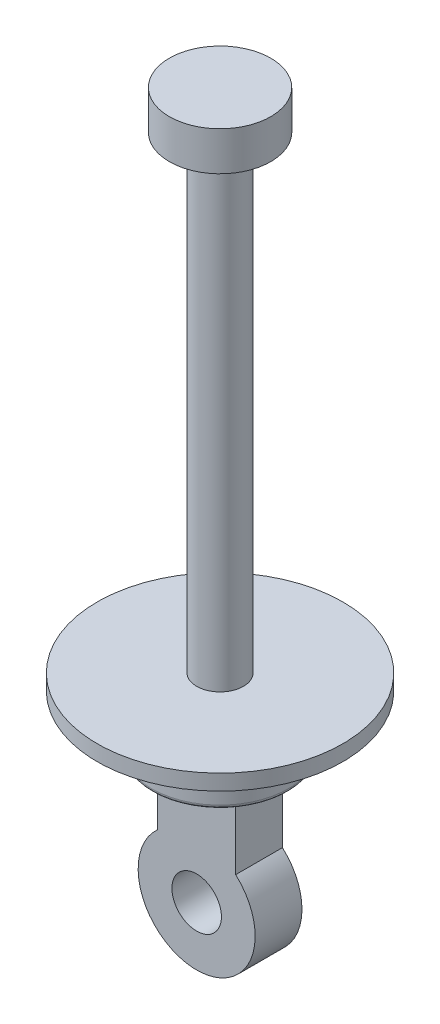
ISO-10303-21;
HEADER;
FILE_DESCRIPTION(('STEP AP214'),'2;1');
FILE_NAME('part.step','',(''),(''),'','','');
FILE_SCHEMA(('AUTOMOTIVE_DESIGN { 1 0 10303 214 1 1 1 1 }'));
ENDSEC;
DATA;
#1=APPLICATION_CONTEXT('core data for automotive mechanical design processes');
#2=APPLICATION_PROTOCOL_DEFINITION('international standard','automotive_design',2000,#1);
#3=PRODUCT_CONTEXT('',#1,'mechanical');
#4=PRODUCT('Part','Part','',(#3));
#5=PRODUCT_RELATED_PRODUCT_CATEGORY('part','',(#4));
#6=PRODUCT_DEFINITION_FORMATION('','',#4);
#7=PRODUCT_DEFINITION_CONTEXT('part definition',#1,'design');
#8=PRODUCT_DEFINITION('design','',#6,#7);
#9=PRODUCT_DEFINITION_SHAPE('','',#8);
#10=(LENGTH_UNIT() NAMED_UNIT(*) SI_UNIT(.MILLI.,.METRE.));
#11=(NAMED_UNIT(*) PLANE_ANGLE_UNIT() SI_UNIT($,.RADIAN.));
#12=(NAMED_UNIT(*) SI_UNIT($,.STERADIAN.) SOLID_ANGLE_UNIT());
#13=UNCERTAINTY_MEASURE_WITH_UNIT(LENGTH_MEASURE(1.E-05),#10,'distance_accuracy_value','');
#14=(GEOMETRIC_REPRESENTATION_CONTEXT(3) GLOBAL_UNCERTAINTY_ASSIGNED_CONTEXT((#13)) GLOBAL_UNIT_ASSIGNED_CONTEXT((#10,
#11,#12)) REPRESENTATION_CONTEXT('',''));
#15=CARTESIAN_POINT('',(0.,0.,0.));
#16=DIRECTION('',(0.,0.,1.));
#17=DIRECTION('',(1.,0.,0.));
#18=AXIS2_PLACEMENT_3D('',#15,#16,#17);
#19=CARTESIAN_POINT('',(0.,163.,0.));
#20=DIRECTION('',(0.,-1.,0.));
#21=DIRECTION('',(0.,0.,-1.));
#22=AXIS2_PLACEMENT_3D('',#19,#20,#21);
#23=CYLINDRICAL_SURFACE('',#22,6.);
#24=CARTESIAN_POINT('',(0.,33.,0.));
#25=DIRECTION('',(0.,-1.,0.));
#26=DIRECTION('',(0.,0.,-1.));
#27=AXIS2_PLACEMENT_3D('',#24,#25,#26);
#28=CIRCLE('',#27,6.);
#29=CARTESIAN_POINT('',(0.,33.,-6.));
#30=VERTEX_POINT('',#29);
#31=EDGE_CURVE('E43',#30,#30,#28,.F.);
#32=ORIENTED_EDGE('',*,*,#31,.T.);
#33=EDGE_LOOP('',(#32));
#34=FACE_BOUND('',#33,.T.);
#35=CARTESIAN_POINT('',(0.,153.,0.));
#36=DIRECTION('',(0.,1.,0.));
#37=DIRECTION('',(0.,0.,1.));
#38=AXIS2_PLACEMENT_3D('',#35,#36,#37);
#39=CIRCLE('',#38,6.);
#40=CARTESIAN_POINT('',(0.,153.,6.));
#41=VERTEX_POINT('',#40);
#42=EDGE_CURVE('E11',#41,#41,#39,.T.);
#43=ORIENTED_EDGE('',*,*,#42,.F.);
#44=EDGE_LOOP('',(#43));
#45=FACE_BOUND('',#44,.T.);
#46=ADVANCED_FACE('F35',(#34,#45),#23,.T.);
#47=CARTESIAN_POINT('',(2.19963451749891E-13,33.,-31.5));
#48=DIRECTION('',(0.,-1.,0.));
#49=DIRECTION('',(0.,0.,-1.));
#50=AXIS2_PLACEMENT_3D('',#47,#48,#49);
#51=PLANE('',#50);
#52=CARTESIAN_POINT('',(0.,33.,0.));
#53=DIRECTION('',(0.,-1.,0.));
#54=DIRECTION('',(0.,0.,-1.));
#55=AXIS2_PLACEMENT_3D('',#52,#53,#54);
#56=CIRCLE('',#55,31.5);
#57=CARTESIAN_POINT('',(0.,33.,-31.5));
#58=VERTEX_POINT('',#57);
#59=EDGE_CURVE('E255',#58,#58,#56,.T.);
#60=ORIENTED_EDGE('',*,*,#59,.F.);
#61=EDGE_LOOP('',(#60));
#62=FACE_BOUND('',#61,.T.);
#63=ORIENTED_EDGE('',*,*,#31,.F.);
#64=EDGE_LOOP('',(#63));
#65=FACE_BOUND('',#64,.T.);
#66=ADVANCED_FACE('F159',(#62,#65),#51,.F.);
#67=CARTESIAN_POINT('',(0.,-15.,6.));
#68=DIRECTION('',(0.,0.,-1.));
#69=DIRECTION('',(-1.,0.,0.));
#70=AXIS2_PLACEMENT_3D('',#67,#68,#69);
#71=CYLINDRICAL_SURFACE('',#70,15.);
#72=CARTESIAN_POINT('',(0.,-15.,-6.));
#73=DIRECTION('',(0.,0.,1.));
#74=DIRECTION('',(1.,0.,0.));
#75=AXIS2_PLACEMENT_3D('',#72,#73,#74);
#76=CIRCLE('',#75,15.);
#77=CARTESIAN_POINT('',(-10.,-3.81966011250106,-6.));
#78=VERTEX_POINT('',#77);
#79=CARTESIAN_POINT('',(10.,-3.81966011250105,-6.));
#80=VERTEX_POINT('',#79);
#81=EDGE_CURVE('E89',#78,#80,#76,.T.);
#82=ORIENTED_EDGE('',*,*,#81,.T.);
#83=DIRECTION('',(0.,0.,1.));
#84=VECTOR('',#83,1.);
#85=CARTESIAN_POINT('',(10.,-3.81966011250105,-6.));
#86=LINE('',#85,#84);
#87=CARTESIAN_POINT('',(10.,-3.81966011250105,6.));
#88=VERTEX_POINT('',#87);
#89=EDGE_CURVE('E92',#80,#88,#86,.T.);
#90=ORIENTED_EDGE('',*,*,#89,.T.);
#91=CARTESIAN_POINT('',(0.,-15.,6.));
#92=DIRECTION('',(0.,0.,1.));
#93=DIRECTION('',(1.,0.,0.));
#94=AXIS2_PLACEMENT_3D('',#91,#92,#93);
#95=CIRCLE('',#94,15.);
#96=CARTESIAN_POINT('',(-10.,-3.81966011250106,6.));
#97=VERTEX_POINT('',#96);
#98=EDGE_CURVE('E101',#97,#88,#95,.T.);
#99=ORIENTED_EDGE('',*,*,#98,.F.);
#100=DIRECTION('',(0.,0.,1.));
#101=VECTOR('',#100,1.);
#102=CARTESIAN_POINT('',(-10.,-3.81966011250106,-6.));
#103=LINE('',#102,#101);
#104=EDGE_CURVE('E99',#78,#97,#103,.T.);
#105=ORIENTED_EDGE('',*,*,#104,.F.);
#106=EDGE_LOOP('',(#82,#90,#99,#105));
#107=FACE_BOUND('',#106,.T.);
#108=ADVANCED_FACE('F97',(#107),#71,.T.);
#109=CARTESIAN_POINT('',(0.,-15.,6.));
#110=DIRECTION('',(0.,0.,1.));
#111=DIRECTION('',(1.,0.,0.));
#112=AXIS2_PLACEMENT_3D('',#109,#110,#111);
#113=PLANE('',#112);
#114=DIRECTION('',(0.,-1.,0.));
#115=VECTOR('',#114,1.);
#116=CARTESIAN_POINT('',(10.,-3.81966011250105,6.));
#117=LINE('',#116,#115);
#118=CARTESIAN_POINT('',(10.,13.,6.));
#119=VERTEX_POINT('',#118);
#120=EDGE_CURVE('E93',#119,#88,#117,.T.);
#121=ORIENTED_EDGE('',*,*,#120,.F.);
#122=DIRECTION('',(-1.,0.,0.));
#123=VECTOR('',#122,1.);
#124=CARTESIAN_POINT('',(0.,13.,6.));
#125=LINE('',#124,#123);
#126=CARTESIAN_POINT('',(-10.,13.,6.));
#127=VERTEX_POINT('',#126);
#128=EDGE_CURVE('E139',#119,#127,#125,.T.);
#129=ORIENTED_EDGE('',*,*,#128,.T.);
#130=DIRECTION('',(0.,1.,0.));
#131=VECTOR('',#130,1.);
#132=CARTESIAN_POINT('',(-10.,-3.81966011250106,6.));
#133=LINE('',#132,#131);
#134=EDGE_CURVE('E106',#97,#127,#133,.T.);
#135=ORIENTED_EDGE('',*,*,#134,.F.);
#136=ORIENTED_EDGE('',*,*,#98,.T.);
#137=EDGE_LOOP('',(#121,#129,#135,#136));
#138=FACE_BOUND('',#137,.T.);
#139=CARTESIAN_POINT('',(0.,-15.,6.));
#140=DIRECTION('',(0.,0.,1.));
#141=DIRECTION('',(1.,0.,0.));
#142=AXIS2_PLACEMENT_3D('',#139,#140,#141);
#143=CIRCLE('',#142,6.35);
#144=CARTESIAN_POINT('',(6.35,-15.,6.));
#145=VERTEX_POINT('',#144);
#146=EDGE_CURVE('E115',#145,#145,#143,.T.);
#147=ORIENTED_EDGE('',*,*,#146,.F.);
#148=EDGE_LOOP('',(#147));
#149=FACE_BOUND('',#148,.T.);
#150=ADVANCED_FACE('F167',(#138,#149),#113,.T.);
#151=CARTESIAN_POINT('',(0.,-15.,-6.));
#152=DIRECTION('',(0.,0.,1.));
#153=DIRECTION('',(1.,0.,0.));
#154=AXIS2_PLACEMENT_3D('',#151,#152,#153);
#155=PLANE('',#154);
#156=CARTESIAN_POINT('',(0.,-15.,-6.));
#157=DIRECTION('',(0.,0.,1.));
#158=DIRECTION('',(1.,0.,0.));
#159=AXIS2_PLACEMENT_3D('',#156,#157,#158);
#160=CIRCLE('',#159,6.35);
#161=CARTESIAN_POINT('',(6.35,-15.,-6.));
#162=VERTEX_POINT('',#161);
#163=EDGE_CURVE('E102',#162,#162,#160,.T.);
#164=ORIENTED_EDGE('',*,*,#163,.T.);
#165=EDGE_LOOP('',(#164));
#166=FACE_BOUND('',#165,.T.);
#167=DIRECTION('',(0.,1.,0.));
#168=VECTOR('',#167,1.);
#169=CARTESIAN_POINT('',(-10.,-3.81966011250106,-6.));
#170=LINE('',#169,#168);
#171=CARTESIAN_POINT('',(-10.,13.,-6.));
#172=VERTEX_POINT('',#171);
#173=EDGE_CURVE('E109',#78,#172,#170,.T.);
#174=ORIENTED_EDGE('',*,*,#173,.T.);
#175=DIRECTION('',(-1.,0.,0.));
#176=VECTOR('',#175,1.);
#177=CARTESIAN_POINT('',(10.,13.,-6.));
#178=LINE('',#177,#176);
#179=CARTESIAN_POINT('',(10.,13.,-6.));
#180=VERTEX_POINT('',#179);
#181=EDGE_CURVE('E50',#172,#180,#178,.F.);
#182=ORIENTED_EDGE('',*,*,#181,.T.);
#183=DIRECTION('',(0.,-1.,0.));
#184=VECTOR('',#183,1.);
#185=CARTESIAN_POINT('',(10.,-3.81966011250105,-6.));
#186=LINE('',#185,#184);
#187=EDGE_CURVE('E86',#180,#80,#186,.T.);
#188=ORIENTED_EDGE('',*,*,#187,.T.);
#189=ORIENTED_EDGE('',*,*,#81,.F.);
#190=EDGE_LOOP('',(#174,#182,#188,#189));
#191=FACE_BOUND('',#190,.T.);
#192=ADVANCED_FACE('F88',(#166,#191),#155,.F.);
#193=CARTESIAN_POINT('',(0.,-15.,-6.));
#194=DIRECTION('',(0.,0.,1.));
#195=DIRECTION('',(1.,0.,0.));
#196=AXIS2_PLACEMENT_3D('',#193,#194,#195);
#197=CYLINDRICAL_SURFACE('',#196,6.35);
#198=ORIENTED_EDGE('',*,*,#163,.F.);
#199=EDGE_LOOP('',(#198));
#200=FACE_BOUND('',#199,.T.);
#201=ORIENTED_EDGE('',*,*,#146,.T.);
#202=EDGE_LOOP('',(#201));
#203=FACE_BOUND('',#202,.T.);
#204=ADVANCED_FACE('F201',(#200,#203),#197,.F.);
#205=CARTESIAN_POINT('',(-10.,-3.81966011250106,-6.));
#206=DIRECTION('',(1.,0.,0.));
#207=DIRECTION('',(0.,1.,0.));
#208=AXIS2_PLACEMENT_3D('',#205,#206,#207);
#209=PLANE('',#208);
#210=ORIENTED_EDGE('',*,*,#134,.T.);
#211=DIRECTION('',(0.,0.,1.));
#212=VECTOR('',#211,1.);
#213=CARTESIAN_POINT('',(-10.,13.,-6.));
#214=LINE('',#213,#212);
#215=EDGE_CURVE('E136',#127,#172,#214,.F.);
#216=ORIENTED_EDGE('',*,*,#215,.T.);
#217=ORIENTED_EDGE('',*,*,#173,.F.);
#218=ORIENTED_EDGE('',*,*,#104,.T.);
#219=EDGE_LOOP('',(#210,#216,#217,#218));
#220=FACE_BOUND('',#219,.T.);
#221=ADVANCED_FACE('F198',(#220),#209,.F.);
#222=CARTESIAN_POINT('',(10.,-3.81966011250105,-6.));
#223=DIRECTION('',(-1.,0.,0.));
#224=DIRECTION('',(0.,-1.,0.));
#225=AXIS2_PLACEMENT_3D('',#222,#223,#224);
#226=PLANE('',#225);
#227=ORIENTED_EDGE('',*,*,#187,.F.);
#228=DIRECTION('',(0.,0.,1.));
#229=VECTOR('',#228,1.);
#230=CARTESIAN_POINT('',(10.,13.,6.));
#231=LINE('',#230,#229);
#232=EDGE_CURVE('E57',#180,#119,#231,.T.);
#233=ORIENTED_EDGE('',*,*,#232,.T.);
#234=ORIENTED_EDGE('',*,*,#120,.T.);
#235=ORIENTED_EDGE('',*,*,#89,.F.);
#236=EDGE_LOOP('',(#227,#233,#234,#235));
#237=FACE_BOUND('',#236,.T.);
#238=ADVANCED_FACE('F104',(#237),#226,.F.);
#239=CARTESIAN_POINT('',(0.,15.,0.));
#240=DIRECTION('',(0.,1.,0.));
#241=DIRECTION('',(0.,0.,1.));
#242=AXIS2_PLACEMENT_3D('',#239,#240,#241);
#243=PLANE('',#242);
#244=DIRECTION('',(-1.,0.,0.));
#245=VECTOR('',#244,1.);
#246=CARTESIAN_POINT('',(-10.,15.,-8.));
#247=LINE('',#246,#245);
#248=CARTESIAN_POINT('',(12.,15.,-8.));
#249=VERTEX_POINT('',#248);
#250=CARTESIAN_POINT('',(-12.,15.,-8.));
#251=VERTEX_POINT('',#250);
#252=EDGE_CURVE('E127',#249,#251,#247,.T.);
#253=ORIENTED_EDGE('',*,*,#252,.T.);
#254=DIRECTION('',(0.,0.,1.));
#255=VECTOR('',#254,1.);
#256=CARTESIAN_POINT('',(-12.,15.,6.));
#257=LINE('',#256,#255);
#258=CARTESIAN_POINT('',(-12.,15.,8.));
#259=VERTEX_POINT('',#258);
#260=EDGE_CURVE('E133',#251,#259,#257,.T.);
#261=ORIENTED_EDGE('',*,*,#260,.T.);
#262=DIRECTION('',(-1.,0.,0.));
#263=VECTOR('',#262,1.);
#264=CARTESIAN_POINT('',(0.,15.,8.));
#265=LINE('',#264,#263);
#266=CARTESIAN_POINT('',(12.,15.,8.));
#267=VERTEX_POINT('',#266);
#268=EDGE_CURVE('E131',#259,#267,#265,.F.);
#269=ORIENTED_EDGE('',*,*,#268,.T.);
#270=DIRECTION('',(0.,0.,1.));
#271=VECTOR('',#270,1.);
#272=CARTESIAN_POINT('',(12.,15.,-6.));
#273=LINE('',#272,#271);
#274=EDGE_CURVE('E129',#267,#249,#273,.F.);
#275=ORIENTED_EDGE('',*,*,#274,.T.);
#276=EDGE_LOOP('',(#253,#261,#269,#275));
#277=FACE_BOUND('',#276,.T.);
#278=CARTESIAN_POINT('',(0.,15.,0.));
#279=DIRECTION('',(0.,1.,0.));
#280=DIRECTION('',(0.,0.,1.));
#281=AXIS2_PLACEMENT_3D('',#278,#279,#280);
#282=CIRCLE('',#281,16.5);
#283=CARTESIAN_POINT('',(0.,15.,16.5));
#284=VERTEX_POINT('',#283);
#285=EDGE_CURVE('E124',#284,#284,#282,.F.);
#286=ORIENTED_EDGE('',*,*,#285,.T.);
#287=EDGE_LOOP('',(#286));
#288=FACE_BOUND('',#287,.T.);
#289=ADVANCED_FACE('F187',(#277,#288),#243,.F.);
#290=CARTESIAN_POINT('',(0.,25.,0.));
#291=DIRECTION('',(0.,-1.,0.));
#292=DIRECTION('',(0.,0.,-1.));
#293=AXIS2_PLACEMENT_3D('',#290,#291,#292);
#294=CYLINDRICAL_SURFACE('',#293,17.5);
#295=CARTESIAN_POINT('',(0.,16.,0.));
#296=DIRECTION('',(0.,1.,0.));
#297=DIRECTION('',(0.,0.,1.));
#298=AXIS2_PLACEMENT_3D('',#295,#296,#297);
#299=CIRCLE('',#298,17.5);
#300=CARTESIAN_POINT('',(0.,16.,17.5));
#301=VERTEX_POINT('',#300);
#302=EDGE_CURVE('E120',#301,#301,#299,.T.);
#303=ORIENTED_EDGE('',*,*,#302,.T.);
#304=EDGE_LOOP('',(#303));
#305=FACE_BOUND('',#304,.T.);
#306=CARTESIAN_POINT('',(0.,25.,0.));
#307=DIRECTION('',(0.,1.,0.));
#308=DIRECTION('',(0.,0.,1.));
#309=AXIS2_PLACEMENT_3D('',#306,#307,#308);
#310=CIRCLE('',#309,17.5);
#311=CARTESIAN_POINT('',(0.,25.,17.5));
#312=VERTEX_POINT('',#311);
#313=EDGE_CURVE('E153',#312,#312,#310,.T.);
#314=ORIENTED_EDGE('',*,*,#313,.F.);
#315=EDGE_LOOP('',(#314));
#316=FACE_BOUND('',#315,.T.);
#317=ADVANCED_FACE('F190',(#305,#316),#294,.T.);
#318=CARTESIAN_POINT('',(0.,16.,0.));
#319=DIRECTION('',(0.,1.,0.));
#320=DIRECTION('',(0.,0.,1.));
#321=AXIS2_PLACEMENT_3D('',#318,#319,#320);
#322=TOROIDAL_SURFACE('',#321,16.5,1.);
#323=ORIENTED_EDGE('',*,*,#285,.F.);
#324=EDGE_LOOP('',(#323));
#325=FACE_BOUND('',#324,.T.);
#326=ORIENTED_EDGE('',*,*,#302,.F.);
#327=EDGE_LOOP('',(#326));
#328=FACE_BOUND('',#327,.T.);
#329=ADVANCED_FACE('F194',(#325,#328),#322,.T.);
#330=CARTESIAN_POINT('',(12.,13.,-6.));
#331=DIRECTION('',(0.,0.,-1.));
#332=DIRECTION('',(-1.,0.,0.));
#333=AXIS2_PLACEMENT_3D('',#330,#331,#332);
#334=CYLINDRICAL_SURFACE('',#333,2.);
#335=CARTESIAN_POINT('',(12.,13.,8.));
#336=DIRECTION('',(0.707106781186547,0.,-0.707106781186547));
#337=DIRECTION('',(-0.707106781186547,0.,-0.707106781186547));
#338=AXIS2_PLACEMENT_3D('',#335,#336,#337);
#339=ELLIPSE('',#338,2.82842712474619,2.);
#340=EDGE_CURVE('E148',#119,#267,#339,.T.);
#341=ORIENTED_EDGE('',*,*,#340,.F.);
#342=ORIENTED_EDGE('',*,*,#232,.F.);
#343=CARTESIAN_POINT('',(12.,13.,-8.));
#344=DIRECTION('',(0.707106781186547,0.,0.707106781186547));
#345=DIRECTION('',(0.707106781186547,0.,-0.707106781186547));
#346=AXIS2_PLACEMENT_3D('',#343,#344,#345);
#347=ELLIPSE('',#346,2.82842712474619,2.);
#348=EDGE_CURVE('E151',#249,#180,#347,.T.);
#349=ORIENTED_EDGE('',*,*,#348,.F.);
#350=ORIENTED_EDGE('',*,*,#274,.F.);
#351=EDGE_LOOP('',(#341,#342,#349,#350));
#352=FACE_BOUND('',#351,.T.);
#353=ADVANCED_FACE('F37',(#352),#334,.F.);
#354=CARTESIAN_POINT('',(0.,13.,-8.));
#355=DIRECTION('',(1.,0.,0.));
#356=DIRECTION('',(0.,0.,-1.));
#357=AXIS2_PLACEMENT_3D('',#354,#355,#356);
#358=CYLINDRICAL_SURFACE('',#357,2.);
#359=ORIENTED_EDGE('',*,*,#348,.T.);
#360=ORIENTED_EDGE('',*,*,#181,.F.);
#361=CARTESIAN_POINT('',(-12.,13.,-8.));
#362=DIRECTION('',(0.707106781186547,0.,-0.707106781186547));
#363=DIRECTION('',(0.707106781186547,0.,0.707106781186547));
#364=AXIS2_PLACEMENT_3D('',#361,#362,#363);
#365=ELLIPSE('',#364,2.82842712474619,2.);
#366=EDGE_CURVE('E145',#251,#172,#365,.T.);
#367=ORIENTED_EDGE('',*,*,#366,.F.);
#368=ORIENTED_EDGE('',*,*,#252,.F.);
#369=EDGE_LOOP('',(#359,#360,#367,#368));
#370=FACE_BOUND('',#369,.T.);
#371=ADVANCED_FACE('F220',(#370),#358,.F.);
#372=CARTESIAN_POINT('',(0.,13.,8.));
#373=DIRECTION('',(-1.,0.,0.));
#374=DIRECTION('',(0.,0.,1.));
#375=AXIS2_PLACEMENT_3D('',#372,#373,#374);
#376=CYLINDRICAL_SURFACE('',#375,2.);
#377=ORIENTED_EDGE('',*,*,#340,.T.);
#378=ORIENTED_EDGE('',*,*,#268,.F.);
#379=CARTESIAN_POINT('',(-12.,13.,8.));
#380=DIRECTION('',(-0.707106781186547,0.,-0.707106781186547));
#381=DIRECTION('',(-0.707106781186547,0.,0.707106781186547));
#382=AXIS2_PLACEMENT_3D('',#379,#380,#381);
#383=ELLIPSE('',#382,2.82842712474619,2.);
#384=EDGE_CURVE('E143',#127,#259,#383,.F.);
#385=ORIENTED_EDGE('',*,*,#384,.F.);
#386=ORIENTED_EDGE('',*,*,#128,.F.);
#387=EDGE_LOOP('',(#377,#378,#385,#386));
#388=FACE_BOUND('',#387,.T.);
#389=ADVANCED_FACE('F217',(#388),#376,.F.);
#390=CARTESIAN_POINT('',(-12.,13.,0.));
#391=DIRECTION('',(0.,0.,-1.));
#392=DIRECTION('',(-1.,0.,0.));
#393=AXIS2_PLACEMENT_3D('',#390,#391,#392);
#394=CYLINDRICAL_SURFACE('',#393,2.);
#395=ORIENTED_EDGE('',*,*,#366,.T.);
#396=ORIENTED_EDGE('',*,*,#215,.F.);
#397=ORIENTED_EDGE('',*,*,#384,.T.);
#398=ORIENTED_EDGE('',*,*,#260,.F.);
#399=EDGE_LOOP('',(#395,#396,#397,#398));
#400=FACE_BOUND('',#399,.T.);
#401=ADVANCED_FACE('F185',(#400),#394,.F.);
#402=CARTESIAN_POINT('',(0.,25.,0.));
#403=DIRECTION('',(0.,1.,0.));
#404=DIRECTION('',(0.,0.,1.));
#405=AXIS2_PLACEMENT_3D('',#402,#403,#404);
#406=PLANE('',#405);
#407=CARTESIAN_POINT('',(0.,25.,0.));
#408=DIRECTION('',(0.,-1.,0.));
#409=DIRECTION('',(0.,0.,-1.));
#410=AXIS2_PLACEMENT_3D('',#407,#408,#409);
#411=CIRCLE('',#410,22.5);
#412=CARTESIAN_POINT('',(0.,25.,-22.5));
#413=VERTEX_POINT('',#412);
#414=EDGE_CURVE('E146',#413,#413,#411,.T.);
#415=ORIENTED_EDGE('',*,*,#414,.T.);
#416=EDGE_LOOP('',(#415));
#417=FACE_BOUND('',#416,.T.);
#418=ORIENTED_EDGE('',*,*,#313,.T.);
#419=EDGE_LOOP('',(#418));
#420=FACE_BOUND('',#419,.T.);
#421=ADVANCED_FACE('F181',(#417,#420),#406,.F.);
#422=CARTESIAN_POINT('',(0.,29.,0.));
#423=DIRECTION('',(0.,1.,0.));
#424=DIRECTION('',(0.,0.,1.));
#425=AXIS2_PLACEMENT_3D('',#422,#423,#424);
#426=CONICAL_SURFACE('',#425,31.5,1.15257199721567);
#427=ORIENTED_EDGE('',*,*,#414,.F.);
#428=EDGE_LOOP('',(#427));
#429=FACE_BOUND('',#428,.T.);
#430=CARTESIAN_POINT('',(0.,29.,0.));
#431=DIRECTION('',(0.,-1.,0.));
#432=DIRECTION('',(0.,0.,-1.));
#433=AXIS2_PLACEMENT_3D('',#430,#431,#432);
#434=CIRCLE('',#433,31.5);
#435=CARTESIAN_POINT('',(0.,29.,-31.5));
#436=VERTEX_POINT('',#435);
#437=EDGE_CURVE('E252',#436,#436,#434,.T.);
#438=ORIENTED_EDGE('',*,*,#437,.T.);
#439=EDGE_LOOP('',(#438));
#440=FACE_BOUND('',#439,.T.);
#441=ADVANCED_FACE('F177',(#429,#440),#426,.T.);
#442=CARTESIAN_POINT('',(0.,0.,0.));
#443=DIRECTION('',(0.,-1.,0.));
#444=DIRECTION('',(0.,0.,-1.));
#445=AXIS2_PLACEMENT_3D('',#442,#443,#444);
#446=CYLINDRICAL_SURFACE('',#445,31.5);
#447=ORIENTED_EDGE('',*,*,#437,.F.);
#448=EDGE_LOOP('',(#447));
#449=FACE_BOUND('',#448,.T.);
#450=ORIENTED_EDGE('',*,*,#59,.T.);
#451=EDGE_LOOP('',(#450));
#452=FACE_BOUND('',#451,.T.);
#453=ADVANCED_FACE('F173',(#449,#452),#446,.T.);
#454=CARTESIAN_POINT('',(0.,153.,0.));
#455=DIRECTION('',(0.,1.,0.));
#456=DIRECTION('',(0.,0.,1.));
#457=AXIS2_PLACEMENT_3D('',#454,#455,#456);
#458=PLANE('',#457);
#459=CARTESIAN_POINT('',(0.,153.,0.));
#460=DIRECTION('',(0.,1.,0.));
#461=DIRECTION('',(0.,0.,1.));
#462=AXIS2_PLACEMENT_3D('',#459,#460,#461);
#463=CIRCLE('',#462,13.);
#464=CARTESIAN_POINT('',(0.,153.,13.));
#465=VERTEX_POINT('',#464);
#466=EDGE_CURVE('E258',#465,#465,#463,.T.);
#467=ORIENTED_EDGE('',*,*,#466,.F.);
#468=EDGE_LOOP('',(#467));
#469=FACE_BOUND('',#468,.T.);
#470=ORIENTED_EDGE('',*,*,#42,.T.);
#471=EDGE_LOOP('',(#470));
#472=FACE_BOUND('',#471,.T.);
#473=ADVANCED_FACE('F176',(#469,#472),#458,.F.);
#474=CARTESIAN_POINT('',(0.,153.,0.));
#475=DIRECTION('',(0.,1.,0.));
#476=DIRECTION('',(0.,0.,1.));
#477=AXIS2_PLACEMENT_3D('',#474,#475,#476);
#478=CYLINDRICAL_SURFACE('',#477,13.);
#479=ORIENTED_EDGE('',*,*,#466,.T.);
#480=EDGE_LOOP('',(#479));
#481=FACE_BOUND('',#480,.T.);
#482=CARTESIAN_POINT('',(0.,163.,0.));
#483=DIRECTION('',(0.,1.,0.));
#484=DIRECTION('',(0.,0.,1.));
#485=AXIS2_PLACEMENT_3D('',#482,#483,#484);
#486=CIRCLE('',#485,13.);
#487=CARTESIAN_POINT('',(0.,163.,13.));
#488=VERTEX_POINT('',#487);
#489=EDGE_CURVE('E259',#488,#488,#486,.T.);
#490=ORIENTED_EDGE('',*,*,#489,.F.);
#491=EDGE_LOOP('',(#490));
#492=FACE_BOUND('',#491,.T.);
#493=ADVANCED_FACE('F265',(#481,#492),#478,.T.);
#494=CARTESIAN_POINT('',(0.,163.,0.));
#495=DIRECTION('',(0.,1.,0.));
#496=DIRECTION('',(0.,0.,1.));
#497=AXIS2_PLACEMENT_3D('',#494,#495,#496);
#498=PLANE('',#497);
#499=ORIENTED_EDGE('',*,*,#489,.T.);
#500=EDGE_LOOP('',(#499));
#501=FACE_BOUND('',#500,.T.);
#502=ADVANCED_FACE('F275',(#501),#498,.T.);
#503=CLOSED_SHELL('',(#46,#66,#108,#150,#192,#204,#221,#238,#289,#317,#329,#353,#371,#389,#401,
#421,#441,#453,#473,#493,#502));
#504=MANIFOLD_SOLID_BREP('B2',#503);
#505=ADVANCED_BREP_SHAPE_REPRESENTATION('',(#18,#504),#14);
#506=SHAPE_DEFINITION_REPRESENTATION(#9,#505);
ENDSEC;
END-ISO-10303-21;
